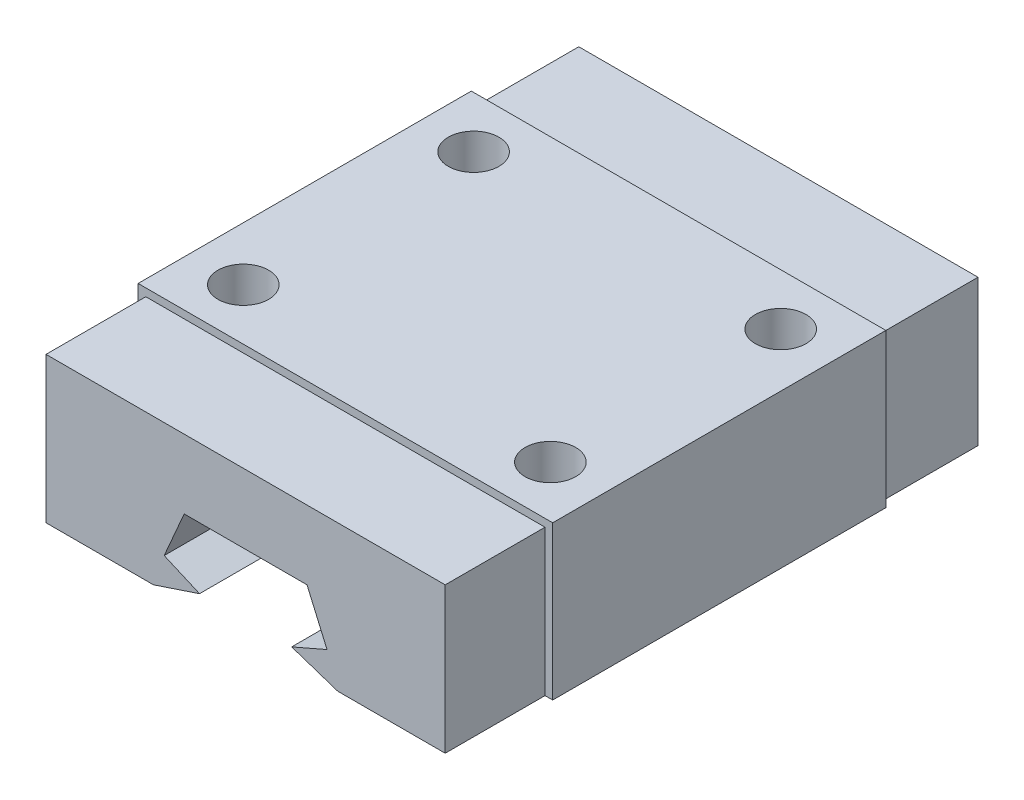
ISO-10303-21;
HEADER;
FILE_DESCRIPTION(('STEP AP214'),'2;1');
FILE_NAME('part.step','',(''),(''),'','','');
FILE_SCHEMA(('AUTOMOTIVE_DESIGN { 1 0 10303 214 1 1 1 1 }'));
ENDSEC;
DATA;
#1=APPLICATION_CONTEXT('core data for automotive mechanical design processes');
#2=APPLICATION_PROTOCOL_DEFINITION('international standard','automotive_design',2000,#1);
#3=PRODUCT_CONTEXT('',#1,'mechanical');
#4=PRODUCT('Part','Part','',(#3));
#5=PRODUCT_RELATED_PRODUCT_CATEGORY('part','',(#4));
#6=PRODUCT_DEFINITION_FORMATION('','',#4);
#7=PRODUCT_DEFINITION_CONTEXT('part definition',#1,'design');
#8=PRODUCT_DEFINITION('design','',#6,#7);
#9=PRODUCT_DEFINITION_SHAPE('','',#8);
#10=(LENGTH_UNIT() NAMED_UNIT(*) SI_UNIT(.MILLI.,.METRE.));
#11=(NAMED_UNIT(*) PLANE_ANGLE_UNIT() SI_UNIT($,.RADIAN.));
#12=(NAMED_UNIT(*) SI_UNIT($,.STERADIAN.) SOLID_ANGLE_UNIT());
#13=UNCERTAINTY_MEASURE_WITH_UNIT(LENGTH_MEASURE(1.E-05),#10,'distance_accuracy_value','');
#14=(GEOMETRIC_REPRESENTATION_CONTEXT(3) GLOBAL_UNCERTAINTY_ASSIGNED_CONTEXT((#13)) GLOBAL_UNIT_ASSIGNED_CONTEXT((#10,
#11,#12)) REPRESENTATION_CONTEXT('',''));
#15=CARTESIAN_POINT('',(0.,0.,0.));
#16=DIRECTION('',(0.,0.,1.));
#17=DIRECTION('',(1.,0.,0.));
#18=AXIS2_PLACEMENT_3D('',#15,#16,#17);
#19=CARTESIAN_POINT('',(0.,-5.,0.));
#20=DIRECTION('',(0.,-1.,0.));
#21=DIRECTION('',(0.,0.,-1.));
#22=AXIS2_PLACEMENT_3D('',#19,#20,#21);
#23=PLANE('',#22);
#24=CARTESIAN_POINT('',(-10.,-5.00000000000001,7.5));
#25=DIRECTION('',(0.,1.,0.));
#26=DIRECTION('',(0.,0.,1.));
#27=AXIS2_PLACEMENT_3D('',#24,#25,#26);
#28=CIRCLE('',#27,1.64999999999998);
#29=CARTESIAN_POINT('',(-10.,-5.00000000000001,9.14999999999998));
#30=VERTEX_POINT('',#29);
#31=EDGE_CURVE('E426',#30,#30,#28,.T.);
#32=ORIENTED_EDGE('',*,*,#31,.T.);
#33=EDGE_LOOP('',(#32));
#34=FACE_BOUND('',#33,.T.);
#35=CARTESIAN_POINT('',(-10.,-5.00000000000001,-7.5));
#36=DIRECTION('',(0.,1.,0.));
#37=DIRECTION('',(0.,0.,1.));
#38=AXIS2_PLACEMENT_3D('',#35,#36,#37);
#39=CIRCLE('',#38,1.64999999999998);
#40=CARTESIAN_POINT('',(-10.,-5.00000000000001,-5.85000000000002));
#41=VERTEX_POINT('',#40);
#42=EDGE_CURVE('E418',#41,#41,#39,.T.);
#43=ORIENTED_EDGE('',*,*,#42,.T.);
#44=EDGE_LOOP('',(#43));
#45=FACE_BOUND('',#44,.T.);
#46=DIRECTION('',(0.,0.,1.));
#47=VECTOR('',#46,1.);
#48=CARTESIAN_POINT('',(-6.,-5.,-17.35));
#49=LINE('',#48,#47);
#50=CARTESIAN_POINT('',(-6.,-5.,-17.35));
#51=VERTEX_POINT('',#50);
#52=CARTESIAN_POINT('',(-6.,-5.,17.35));
#53=VERTEX_POINT('',#52);
#54=EDGE_CURVE('E298',#51,#53,#49,.T.);
#55=ORIENTED_EDGE('',*,*,#54,.T.);
#56=DIRECTION('',(1.,0.,0.));
#57=VECTOR('',#56,1.);
#58=CARTESIAN_POINT('',(13.,-5.,17.35));
#59=LINE('',#58,#57);
#60=CARTESIAN_POINT('',(-13.,-5.,17.35));
#61=VERTEX_POINT('',#60);
#62=EDGE_CURVE('E207',#61,#53,#59,.T.);
#63=ORIENTED_EDGE('',*,*,#62,.F.);
#64=DIRECTION('',(0.,0.,-1.));
#65=VECTOR('',#64,1.);
#66=CARTESIAN_POINT('',(-13.,-5.,17.35));
#67=LINE('',#66,#65);
#68=CARTESIAN_POINT('',(-13.,-5.,10.85));
#69=VERTEX_POINT('',#68);
#70=EDGE_CURVE('E217',#61,#69,#67,.T.);
#71=ORIENTED_EDGE('',*,*,#70,.T.);
#72=DIRECTION('',(-1.,0.,0.));
#73=VECTOR('',#72,1.);
#74=CARTESIAN_POINT('',(13.5,-5.,10.85));
#75=LINE('',#74,#73);
#76=CARTESIAN_POINT('',(-13.5,-5.,10.85));
#77=VERTEX_POINT('',#76);
#78=EDGE_CURVE('E251',#69,#77,#75,.T.);
#79=ORIENTED_EDGE('',*,*,#78,.T.);
#80=DIRECTION('',(0.,0.,-1.));
#81=VECTOR('',#80,1.);
#82=CARTESIAN_POINT('',(-13.5,-5.,10.85));
#83=LINE('',#82,#81);
#84=CARTESIAN_POINT('',(-13.5,-5.,-10.85));
#85=VERTEX_POINT('',#84);
#86=EDGE_CURVE('E179',#77,#85,#83,.T.);
#87=ORIENTED_EDGE('',*,*,#86,.T.);
#88=DIRECTION('',(1.,0.,0.));
#89=VECTOR('',#88,1.);
#90=CARTESIAN_POINT('',(-13.5,-5.,-10.85));
#91=LINE('',#90,#89);
#92=CARTESIAN_POINT('',(-13.,-5.,-10.85));
#93=VERTEX_POINT('',#92);
#94=EDGE_CURVE('E178',#85,#93,#91,.T.);
#95=ORIENTED_EDGE('',*,*,#94,.T.);
#96=DIRECTION('',(0.,0.,1.));
#97=VECTOR('',#96,1.);
#98=CARTESIAN_POINT('',(-13.,-5.,-17.35));
#99=LINE('',#98,#97);
#100=CARTESIAN_POINT('',(-13.,-5.,-17.35));
#101=VERTEX_POINT('',#100);
#102=EDGE_CURVE('E197',#101,#93,#99,.T.);
#103=ORIENTED_EDGE('',*,*,#102,.F.);
#104=DIRECTION('',(-1.,0.,0.));
#105=VECTOR('',#104,1.);
#106=CARTESIAN_POINT('',(-13.,-5.,-17.35));
#107=LINE('',#106,#105);
#108=EDGE_CURVE('E293',#51,#101,#107,.T.);
#109=ORIENTED_EDGE('',*,*,#108,.F.);
#110=EDGE_LOOP('',(#55,#63,#71,#79,#87,#95,#103,#109));
#111=FACE_BOUND('',#110,.T.);
#112=ADVANCED_FACE('F38',(#34,#45,#111),#23,.T.);
#113=CARTESIAN_POINT('',(13.5,5.,-10.85));
#114=DIRECTION('',(1.,0.,0.));
#115=DIRECTION('',(0.,0.,-1.));
#116=AXIS2_PLACEMENT_3D('',#113,#114,#115);
#117=PLANE('',#116);
#118=DIRECTION('',(0.,0.,1.));
#119=VECTOR('',#118,1.);
#120=CARTESIAN_POINT('',(13.5,-5.,-10.85));
#121=LINE('',#120,#119);
#122=CARTESIAN_POINT('',(13.5,-5.,-10.85));
#123=VERTEX_POINT('',#122);
#124=CARTESIAN_POINT('',(13.5,-5.,10.85));
#125=VERTEX_POINT('',#124);
#126=EDGE_CURVE('E237',#123,#125,#121,.T.);
#127=ORIENTED_EDGE('',*,*,#126,.F.);
#128=DIRECTION('',(0.,-1.,0.));
#129=VECTOR('',#128,1.);
#130=CARTESIAN_POINT('',(13.5,5.,-10.85));
#131=LINE('',#130,#129);
#132=CARTESIAN_POINT('',(13.5,5.,-10.85));
#133=VERTEX_POINT('',#132);
#134=EDGE_CURVE('E11',#133,#123,#131,.T.);
#135=ORIENTED_EDGE('',*,*,#134,.F.);
#136=DIRECTION('',(0.,0.,1.));
#137=VECTOR('',#136,1.);
#138=CARTESIAN_POINT('',(13.5,5.,-10.85));
#139=LINE('',#138,#137);
#140=CARTESIAN_POINT('',(13.5,5.,10.85));
#141=VERTEX_POINT('',#140);
#142=EDGE_CURVE('E238',#133,#141,#139,.T.);
#143=ORIENTED_EDGE('',*,*,#142,.T.);
#144=DIRECTION('',(0.,-1.,0.));
#145=VECTOR('',#144,1.);
#146=CARTESIAN_POINT('',(13.5,5.,10.85));
#147=LINE('',#146,#145);
#148=EDGE_CURVE('E249',#141,#125,#147,.T.);
#149=ORIENTED_EDGE('',*,*,#148,.T.);
#150=EDGE_LOOP('',(#127,#135,#143,#149));
#151=FACE_BOUND('',#150,.T.);
#152=ADVANCED_FACE('F382',(#151),#117,.T.);
#153=CARTESIAN_POINT('',(-13.5,5.,-10.85));
#154=DIRECTION('',(0.,0.,-1.));
#155=DIRECTION('',(-1.,0.,0.));
#156=AXIS2_PLACEMENT_3D('',#153,#154,#155);
#157=PLANE('',#156);
#158=DIRECTION('',(0.,1.,0.));
#159=VECTOR('',#158,1.);
#160=CARTESIAN_POINT('',(-13.,4.5,-10.85));
#161=LINE('',#160,#159);
#162=CARTESIAN_POINT('',(-13.,4.5,-10.85));
#163=VERTEX_POINT('',#162);
#164=EDGE_CURVE('E295',#93,#163,#161,.T.);
#165=ORIENTED_EDGE('',*,*,#164,.F.);
#166=ORIENTED_EDGE('',*,*,#94,.F.);
#167=DIRECTION('',(0.,-1.,0.));
#168=VECTOR('',#167,1.);
#169=CARTESIAN_POINT('',(-13.5,5.,-10.85));
#170=LINE('',#169,#168);
#171=CARTESIAN_POINT('',(-13.5,5.,-10.85));
#172=VERTEX_POINT('',#171);
#173=EDGE_CURVE('E48',#172,#85,#170,.T.);
#174=ORIENTED_EDGE('',*,*,#173,.F.);
#175=DIRECTION('',(1.,0.,0.));
#176=VECTOR('',#175,1.);
#177=CARTESIAN_POINT('',(-13.5,5.,-10.85));
#178=LINE('',#177,#176);
#179=EDGE_CURVE('E247',#172,#133,#178,.T.);
#180=ORIENTED_EDGE('',*,*,#179,.T.);
#181=ORIENTED_EDGE('',*,*,#134,.T.);
#182=CARTESIAN_POINT('',(13.,-5.,-10.85));
#183=VERTEX_POINT('',#182);
#184=EDGE_CURVE('E168',#183,#123,#91,.T.);
#185=ORIENTED_EDGE('',*,*,#184,.F.);
#186=DIRECTION('',(0.,-1.,0.));
#187=VECTOR('',#186,1.);
#188=CARTESIAN_POINT('',(13.,-5.,-10.85));
#189=LINE('',#188,#187);
#190=CARTESIAN_POINT('',(13.,4.5,-10.85));
#191=VERTEX_POINT('',#190);
#192=EDGE_CURVE('E171',#191,#183,#189,.T.);
#193=ORIENTED_EDGE('',*,*,#192,.F.);
#194=DIRECTION('',(1.,0.,0.));
#195=VECTOR('',#194,1.);
#196=CARTESIAN_POINT('',(13.,4.5,-10.85));
#197=LINE('',#196,#195);
#198=EDGE_CURVE('E191',#163,#191,#197,.T.);
#199=ORIENTED_EDGE('',*,*,#198,.F.);
#200=EDGE_LOOP('',(#165,#166,#174,#180,#181,#185,#193,#199));
#201=FACE_BOUND('',#200,.T.);
#202=ADVANCED_FACE('F170',(#201),#157,.T.);
#203=CARTESIAN_POINT('',(-13.5,5.,10.85));
#204=DIRECTION('',(-1.,0.,0.));
#205=DIRECTION('',(0.,0.,1.));
#206=AXIS2_PLACEMENT_3D('',#203,#204,#205);
#207=PLANE('',#206);
#208=ORIENTED_EDGE('',*,*,#86,.F.);
#209=DIRECTION('',(0.,-1.,0.));
#210=VECTOR('',#209,1.);
#211=CARTESIAN_POINT('',(-13.5,5.,10.85));
#212=LINE('',#211,#210);
#213=CARTESIAN_POINT('',(-13.5,5.,10.85));
#214=VERTEX_POINT('',#213);
#215=EDGE_CURVE('E259',#214,#77,#212,.T.);
#216=ORIENTED_EDGE('',*,*,#215,.F.);
#217=DIRECTION('',(0.,0.,-1.));
#218=VECTOR('',#217,1.);
#219=CARTESIAN_POINT('',(-13.5,5.,10.85));
#220=LINE('',#219,#218);
#221=EDGE_CURVE('E244',#214,#172,#220,.T.);
#222=ORIENTED_EDGE('',*,*,#221,.T.);
#223=ORIENTED_EDGE('',*,*,#173,.T.);
#224=EDGE_LOOP('',(#208,#216,#222,#223));
#225=FACE_BOUND('',#224,.T.);
#226=ADVANCED_FACE('F449',(#225),#207,.T.);
#227=CARTESIAN_POINT('',(13.5,5.,10.85));
#228=DIRECTION('',(0.,0.,1.));
#229=DIRECTION('',(1.,0.,0.));
#230=AXIS2_PLACEMENT_3D('',#227,#228,#229);
#231=PLANE('',#230);
#232=DIRECTION('',(0.,-1.,0.));
#233=VECTOR('',#232,1.);
#234=CARTESIAN_POINT('',(-13.,-5.,10.85));
#235=LINE('',#234,#233);
#236=CARTESIAN_POINT('',(-13.,4.5,10.85));
#237=VERTEX_POINT('',#236);
#238=EDGE_CURVE('E223',#237,#69,#235,.T.);
#239=ORIENTED_EDGE('',*,*,#238,.F.);
#240=DIRECTION('',(-1.,0.,0.));
#241=VECTOR('',#240,1.);
#242=CARTESIAN_POINT('',(-13.,4.5,10.85));
#243=LINE('',#242,#241);
#244=CARTESIAN_POINT('',(13.,4.5,10.85));
#245=VERTEX_POINT('',#244);
#246=EDGE_CURVE('E220',#245,#237,#243,.T.);
#247=ORIENTED_EDGE('',*,*,#246,.F.);
#248=DIRECTION('',(0.,1.,0.));
#249=VECTOR('',#248,1.);
#250=CARTESIAN_POINT('',(13.,4.5,10.85));
#251=LINE('',#250,#249);
#252=CARTESIAN_POINT('',(13.,-5.,10.85));
#253=VERTEX_POINT('',#252);
#254=EDGE_CURVE('E206',#253,#245,#251,.T.);
#255=ORIENTED_EDGE('',*,*,#254,.F.);
#256=EDGE_CURVE('E252',#125,#253,#75,.T.);
#257=ORIENTED_EDGE('',*,*,#256,.F.);
#258=ORIENTED_EDGE('',*,*,#148,.F.);
#259=DIRECTION('',(-1.,0.,0.));
#260=VECTOR('',#259,1.);
#261=CARTESIAN_POINT('',(13.5,5.,10.85));
#262=LINE('',#261,#260);
#263=EDGE_CURVE('E241',#141,#214,#262,.T.);
#264=ORIENTED_EDGE('',*,*,#263,.T.);
#265=ORIENTED_EDGE('',*,*,#215,.T.);
#266=ORIENTED_EDGE('',*,*,#78,.F.);
#267=EDGE_LOOP('',(#239,#247,#255,#257,#258,#264,#265,#266));
#268=FACE_BOUND('',#267,.T.);
#269=ADVANCED_FACE('F407',(#268),#231,.T.);
#270=CARTESIAN_POINT('',(0.,5.,0.));
#271=DIRECTION('',(0.,-1.,0.));
#272=DIRECTION('',(0.,0.,-1.));
#273=AXIS2_PLACEMENT_3D('',#270,#271,#272);
#274=PLANE('',#273);
#275=CARTESIAN_POINT('',(10.,5.,7.5));
#276=DIRECTION('',(0.,1.,0.));
#277=DIRECTION('',(0.,0.,1.));
#278=AXIS2_PLACEMENT_3D('',#275,#276,#277);
#279=CIRCLE('',#278,1.64999999999998);
#280=CARTESIAN_POINT('',(10.,5.,9.14999999999998));
#281=VERTEX_POINT('',#280);
#282=EDGE_CURVE('E432',#281,#281,#279,.T.);
#283=ORIENTED_EDGE('',*,*,#282,.F.);
#284=EDGE_LOOP('',(#283));
#285=FACE_BOUND('',#284,.T.);
#286=CARTESIAN_POINT('',(-10.,5.,7.5));
#287=DIRECTION('',(0.,1.,0.));
#288=DIRECTION('',(0.,0.,1.));
#289=AXIS2_PLACEMENT_3D('',#286,#287,#288);
#290=CIRCLE('',#289,1.64999999999998);
#291=CARTESIAN_POINT('',(-10.,5.,9.14999999999998));
#292=VERTEX_POINT('',#291);
#293=EDGE_CURVE('E428',#292,#292,#290,.T.);
#294=ORIENTED_EDGE('',*,*,#293,.F.);
#295=EDGE_LOOP('',(#294));
#296=FACE_BOUND('',#295,.T.);
#297=CARTESIAN_POINT('',(-10.,5.,-7.5));
#298=DIRECTION('',(0.,1.,0.));
#299=DIRECTION('',(0.,0.,1.));
#300=AXIS2_PLACEMENT_3D('',#297,#298,#299);
#301=CIRCLE('',#300,1.64999999999998);
#302=CARTESIAN_POINT('',(-10.,5.,-5.85000000000001));
#303=VERTEX_POINT('',#302);
#304=EDGE_CURVE('E423',#303,#303,#301,.T.);
#305=ORIENTED_EDGE('',*,*,#304,.F.);
#306=EDGE_LOOP('',(#305));
#307=FACE_BOUND('',#306,.T.);
#308=CARTESIAN_POINT('',(10.,5.,-7.5));
#309=DIRECTION('',(0.,1.,0.));
#310=DIRECTION('',(0.,0.,1.));
#311=AXIS2_PLACEMENT_3D('',#308,#309,#310);
#312=CIRCLE('',#311,1.64999999999998);
#313=CARTESIAN_POINT('',(10.,5.,-5.85000000000001));
#314=VERTEX_POINT('',#313);
#315=EDGE_CURVE('E416',#314,#314,#312,.T.);
#316=ORIENTED_EDGE('',*,*,#315,.F.);
#317=EDGE_LOOP('',(#316));
#318=FACE_BOUND('',#317,.T.);
#319=ORIENTED_EDGE('',*,*,#142,.F.);
#320=ORIENTED_EDGE('',*,*,#179,.F.);
#321=ORIENTED_EDGE('',*,*,#221,.F.);
#322=ORIENTED_EDGE('',*,*,#263,.F.);
#323=EDGE_LOOP('',(#319,#320,#321,#322));
#324=FACE_BOUND('',#323,.T.);
#325=ADVANCED_FACE('F398',(#285,#296,#307,#318,#324),#274,.F.);
#326=CARTESIAN_POINT('',(10.,-5.00000000000001,7.5));
#327=DIRECTION('',(0.,1.,0.));
#328=DIRECTION('',(0.,0.,1.));
#329=AXIS2_PLACEMENT_3D('',#326,#327,#328);
#330=CIRCLE('',#329,1.64999999999998);
#331=CARTESIAN_POINT('',(10.,-5.00000000000001,9.14999999999998));
#332=VERTEX_POINT('',#331);
#333=EDGE_CURVE('E412',#332,#332,#330,.T.);
#334=ORIENTED_EDGE('',*,*,#333,.T.);
#335=EDGE_LOOP('',(#334));
#336=FACE_BOUND('',#335,.T.);
#337=CARTESIAN_POINT('',(10.,-5.00000000000001,-7.5));
#338=DIRECTION('',(0.,1.,0.));
#339=DIRECTION('',(0.,0.,1.));
#340=AXIS2_PLACEMENT_3D('',#337,#338,#339);
#341=CIRCLE('',#340,1.64999999999998);
#342=CARTESIAN_POINT('',(10.,-5.00000000000001,-5.85000000000002));
#343=VERTEX_POINT('',#342);
#344=EDGE_CURVE('E347',#343,#343,#341,.T.);
#345=ORIENTED_EDGE('',*,*,#344,.T.);
#346=EDGE_LOOP('',(#345));
#347=FACE_BOUND('',#346,.T.);
#348=DIRECTION('',(0.,0.,1.));
#349=VECTOR('',#348,1.);
#350=CARTESIAN_POINT('',(6.,-5.,-17.35));
#351=LINE('',#350,#349);
#352=CARTESIAN_POINT('',(6.,-5.,-17.35));
#353=VERTEX_POINT('',#352);
#354=CARTESIAN_POINT('',(6.,-5.,17.35));
#355=VERTEX_POINT('',#354);
#356=EDGE_CURVE('E281',#353,#355,#351,.T.);
#357=ORIENTED_EDGE('',*,*,#356,.F.);
#358=CARTESIAN_POINT('',(13.,-5.,-17.35));
#359=VERTEX_POINT('',#358);
#360=EDGE_CURVE('E196',#359,#353,#107,.T.);
#361=ORIENTED_EDGE('',*,*,#360,.F.);
#362=DIRECTION('',(0.,0.,1.));
#363=VECTOR('',#362,1.);
#364=CARTESIAN_POINT('',(13.,-5.,-17.35));
#365=LINE('',#364,#363);
#366=EDGE_CURVE('E186',#359,#183,#365,.T.);
#367=ORIENTED_EDGE('',*,*,#366,.T.);
#368=ORIENTED_EDGE('',*,*,#184,.T.);
#369=ORIENTED_EDGE('',*,*,#126,.T.);
#370=ORIENTED_EDGE('',*,*,#256,.T.);
#371=DIRECTION('',(0.,0.,-1.));
#372=VECTOR('',#371,1.);
#373=CARTESIAN_POINT('',(13.,-5.,17.35));
#374=LINE('',#373,#372);
#375=CARTESIAN_POINT('',(13.,-5.,17.35));
#376=VERTEX_POINT('',#375);
#377=EDGE_CURVE('E234',#376,#253,#374,.T.);
#378=ORIENTED_EDGE('',*,*,#377,.F.);
#379=EDGE_CURVE('E211',#355,#376,#59,.T.);
#380=ORIENTED_EDGE('',*,*,#379,.F.);
#381=EDGE_LOOP('',(#357,#361,#367,#368,#369,#370,#378,#380));
#382=FACE_BOUND('',#381,.T.);
#383=ADVANCED_FACE('F194',(#336,#347,#382),#23,.T.);
#384=CARTESIAN_POINT('',(13.,4.5,17.35));
#385=DIRECTION('',(-1.,0.,0.));
#386=DIRECTION('',(0.,0.,1.));
#387=AXIS2_PLACEMENT_3D('',#384,#385,#386);
#388=PLANE('',#387);
#389=ORIENTED_EDGE('',*,*,#254,.T.);
#390=DIRECTION('',(0.,0.,-1.));
#391=VECTOR('',#390,1.);
#392=CARTESIAN_POINT('',(13.,4.5,17.35));
#393=LINE('',#392,#391);
#394=CARTESIAN_POINT('',(13.,4.5,17.35));
#395=VERTEX_POINT('',#394);
#396=EDGE_CURVE('E231',#395,#245,#393,.T.);
#397=ORIENTED_EDGE('',*,*,#396,.F.);
#398=DIRECTION('',(0.,1.,0.));
#399=VECTOR('',#398,1.);
#400=CARTESIAN_POINT('',(13.,4.5,17.35));
#401=LINE('',#400,#399);
#402=EDGE_CURVE('E210',#376,#395,#401,.T.);
#403=ORIENTED_EDGE('',*,*,#402,.F.);
#404=ORIENTED_EDGE('',*,*,#377,.T.);
#405=EDGE_LOOP('',(#389,#397,#403,#404));
#406=FACE_BOUND('',#405,.T.);
#407=ADVANCED_FACE('F397',(#406),#388,.F.);
#408=CARTESIAN_POINT('',(-13.,4.5,17.35));
#409=DIRECTION('',(0.,-1.,0.));
#410=DIRECTION('',(0.,0.,-1.));
#411=AXIS2_PLACEMENT_3D('',#408,#409,#410);
#412=PLANE('',#411);
#413=ORIENTED_EDGE('',*,*,#246,.T.);
#414=DIRECTION('',(0.,0.,-1.));
#415=VECTOR('',#414,1.);
#416=CARTESIAN_POINT('',(-13.,4.5,17.35));
#417=LINE('',#416,#415);
#418=CARTESIAN_POINT('',(-13.,4.5,17.35));
#419=VERTEX_POINT('',#418);
#420=EDGE_CURVE('E228',#419,#237,#417,.T.);
#421=ORIENTED_EDGE('',*,*,#420,.F.);
#422=DIRECTION('',(-1.,0.,0.));
#423=VECTOR('',#422,1.);
#424=CARTESIAN_POINT('',(-13.,4.5,17.35));
#425=LINE('',#424,#423);
#426=EDGE_CURVE('E213',#395,#419,#425,.T.);
#427=ORIENTED_EDGE('',*,*,#426,.F.);
#428=ORIENTED_EDGE('',*,*,#396,.T.);
#429=EDGE_LOOP('',(#413,#421,#427,#428));
#430=FACE_BOUND('',#429,.T.);
#431=ADVANCED_FACE('F404',(#430),#412,.F.);
#432=CARTESIAN_POINT('',(-13.,-5.,17.35));
#433=DIRECTION('',(1.,0.,0.));
#434=DIRECTION('',(0.,0.,-1.));
#435=AXIS2_PLACEMENT_3D('',#432,#433,#434);
#436=PLANE('',#435);
#437=ORIENTED_EDGE('',*,*,#238,.T.);
#438=ORIENTED_EDGE('',*,*,#70,.F.);
#439=DIRECTION('',(0.,-1.,0.));
#440=VECTOR('',#439,1.);
#441=CARTESIAN_POINT('',(-13.,-5.,17.35));
#442=LINE('',#441,#440);
#443=EDGE_CURVE('E215',#419,#61,#442,.T.);
#444=ORIENTED_EDGE('',*,*,#443,.F.);
#445=ORIENTED_EDGE('',*,*,#420,.T.);
#446=EDGE_LOOP('',(#437,#438,#444,#445));
#447=FACE_BOUND('',#446,.T.);
#448=ADVANCED_FACE('F476',(#447),#436,.F.);
#449=CARTESIAN_POINT('',(0.,0.,17.35));
#450=DIRECTION('',(0.,0.,-1.));
#451=DIRECTION('',(-1.,0.,0.));
#452=AXIS2_PLACEMENT_3D('',#449,#450,#451);
#453=PLANE('',#452);
#454=ORIENTED_EDGE('',*,*,#62,.T.);
#455=DIRECTION('',(-0.948683298050514,-0.316227766016837,0.));
#456=VECTOR('',#455,1.);
#457=CARTESIAN_POINT('',(-3.,-4.,17.35));
#458=LINE('',#457,#456);
#459=CARTESIAN_POINT('',(-3.,-4.,17.35));
#460=VERTEX_POINT('',#459);
#461=EDGE_CURVE('E338',#460,#53,#458,.T.);
#462=ORIENTED_EDGE('',*,*,#461,.F.);
#463=DIRECTION('',(0.917245737736622,-0.39832180031226,0.));
#464=VECTOR('',#463,1.);
#465=CARTESIAN_POINT('',(-4.,-3.56574145408934,17.35));
#466=LINE('',#465,#464);
#467=CARTESIAN_POINT('',(-5.302775637732,-3.,17.35));
#468=VERTEX_POINT('',#467);
#469=EDGE_CURVE('E266',#468,#460,#466,.T.);
#470=ORIENTED_EDGE('',*,*,#469,.F.);
#471=DIRECTION('',(0.398321800312263,0.917245737736621,0.));
#472=VECTOR('',#471,1.);
#473=CARTESIAN_POINT('',(-4.,0.,17.35));
#474=LINE('',#473,#472);
#475=CARTESIAN_POINT('',(-4.,0.,17.35));
#476=VERTEX_POINT('',#475);
#477=EDGE_CURVE('E263',#476,#468,#474,.F.);
#478=ORIENTED_EDGE('',*,*,#477,.F.);
#479=DIRECTION('',(-1.,0.,0.));
#480=VECTOR('',#479,1.);
#481=CARTESIAN_POINT('',(4.,0.,17.35));
#482=LINE('',#481,#480);
#483=CARTESIAN_POINT('',(4.,0.,17.35));
#484=VERTEX_POINT('',#483);
#485=EDGE_CURVE('E267',#484,#476,#482,.T.);
#486=ORIENTED_EDGE('',*,*,#485,.F.);
#487=DIRECTION('',(0.398321800312263,-0.917245737736621,0.));
#488=VECTOR('',#487,1.);
#489=CARTESIAN_POINT('',(4.,0.,17.35));
#490=LINE('',#489,#488);
#491=CARTESIAN_POINT('',(5.302775637732,-3.,17.35));
#492=VERTEX_POINT('',#491);
#493=EDGE_CURVE('E277',#492,#484,#490,.F.);
#494=ORIENTED_EDGE('',*,*,#493,.F.);
#495=DIRECTION('',(0.917245737736622,0.398321800312261,0.));
#496=VECTOR('',#495,1.);
#497=CARTESIAN_POINT('',(3.,-4.,17.35));
#498=LINE('',#497,#496);
#499=CARTESIAN_POINT('',(3.,-4.,17.35));
#500=VERTEX_POINT('',#499);
#501=EDGE_CURVE('E278',#500,#492,#498,.T.);
#502=ORIENTED_EDGE('',*,*,#501,.F.);
#503=DIRECTION('',(-0.948683298050514,0.316227766016838,0.));
#504=VECTOR('',#503,1.);
#505=CARTESIAN_POINT('',(6.,-5.,17.35));
#506=LINE('',#505,#504);
#507=EDGE_CURVE('E345',#355,#500,#506,.T.);
#508=ORIENTED_EDGE('',*,*,#507,.F.);
#509=ORIENTED_EDGE('',*,*,#379,.T.);
#510=ORIENTED_EDGE('',*,*,#402,.T.);
#511=ORIENTED_EDGE('',*,*,#426,.T.);
#512=ORIENTED_EDGE('',*,*,#443,.T.);
#513=EDGE_LOOP('',(#454,#462,#470,#478,#486,#494,#502,#508,#509,#510,#511,#512));
#514=FACE_BOUND('',#513,.T.);
#515=ADVANCED_FACE('F364',(#514),#453,.F.);
#516=CARTESIAN_POINT('',(-13.,4.5,-17.35));
#517=DIRECTION('',(1.,0.,0.));
#518=DIRECTION('',(0.,0.,-1.));
#519=AXIS2_PLACEMENT_3D('',#516,#517,#518);
#520=PLANE('',#519);
#521=ORIENTED_EDGE('',*,*,#164,.T.);
#522=DIRECTION('',(0.,0.,1.));
#523=VECTOR('',#522,1.);
#524=CARTESIAN_POINT('',(-13.,4.5,-17.35));
#525=LINE('',#524,#523);
#526=CARTESIAN_POINT('',(-13.,4.5,-17.35));
#527=VERTEX_POINT('',#526);
#528=EDGE_CURVE('E199',#527,#163,#525,.T.);
#529=ORIENTED_EDGE('',*,*,#528,.F.);
#530=DIRECTION('',(0.,1.,0.));
#531=VECTOR('',#530,1.);
#532=CARTESIAN_POINT('',(-13.,4.5,-17.35));
#533=LINE('',#532,#531);
#534=EDGE_CURVE('E190',#101,#527,#533,.T.);
#535=ORIENTED_EDGE('',*,*,#534,.F.);
#536=ORIENTED_EDGE('',*,*,#102,.T.);
#537=EDGE_LOOP('',(#521,#529,#535,#536));
#538=FACE_BOUND('',#537,.T.);
#539=ADVANCED_FACE('F310',(#538),#520,.F.);
#540=CARTESIAN_POINT('',(13.,4.5,-17.35));
#541=DIRECTION('',(0.,-1.,0.));
#542=DIRECTION('',(0.,0.,-1.));
#543=AXIS2_PLACEMENT_3D('',#540,#541,#542);
#544=PLANE('',#543);
#545=ORIENTED_EDGE('',*,*,#198,.T.);
#546=DIRECTION('',(0.,0.,1.));
#547=VECTOR('',#546,1.);
#548=CARTESIAN_POINT('',(13.,4.5,-17.35));
#549=LINE('',#548,#547);
#550=CARTESIAN_POINT('',(13.,4.5,-17.35));
#551=VERTEX_POINT('',#550);
#552=EDGE_CURVE('E189',#551,#191,#549,.T.);
#553=ORIENTED_EDGE('',*,*,#552,.F.);
#554=DIRECTION('',(1.,0.,0.));
#555=VECTOR('',#554,1.);
#556=CARTESIAN_POINT('',(13.,4.5,-17.35));
#557=LINE('',#556,#555);
#558=EDGE_CURVE('E289',#527,#551,#557,.T.);
#559=ORIENTED_EDGE('',*,*,#558,.F.);
#560=ORIENTED_EDGE('',*,*,#528,.T.);
#561=EDGE_LOOP('',(#545,#553,#559,#560));
#562=FACE_BOUND('',#561,.T.);
#563=ADVANCED_FACE('F300',(#562),#544,.F.);
#564=CARTESIAN_POINT('',(13.,-5.,-17.35));
#565=DIRECTION('',(-1.,0.,0.));
#566=DIRECTION('',(0.,0.,1.));
#567=AXIS2_PLACEMENT_3D('',#564,#565,#566);
#568=PLANE('',#567);
#569=ORIENTED_EDGE('',*,*,#192,.T.);
#570=ORIENTED_EDGE('',*,*,#366,.F.);
#571=DIRECTION('',(0.,-1.,0.));
#572=VECTOR('',#571,1.);
#573=CARTESIAN_POINT('',(13.,-5.,-17.35));
#574=LINE('',#573,#572);
#575=EDGE_CURVE('E291',#551,#359,#574,.T.);
#576=ORIENTED_EDGE('',*,*,#575,.F.);
#577=ORIENTED_EDGE('',*,*,#552,.T.);
#578=EDGE_LOOP('',(#569,#570,#576,#577));
#579=FACE_BOUND('',#578,.T.);
#580=ADVANCED_FACE('F184',(#579),#568,.F.);
#581=CARTESIAN_POINT('',(0.,0.,-17.35));
#582=DIRECTION('',(0.,0.,1.));
#583=DIRECTION('',(1.,0.,0.));
#584=AXIS2_PLACEMENT_3D('',#581,#582,#583);
#585=PLANE('',#584);
#586=DIRECTION('',(0.917245737736622,-0.39832180031226,0.));
#587=VECTOR('',#586,1.);
#588=CARTESIAN_POINT('',(-4.,-3.56574145408934,-17.35));
#589=LINE('',#588,#587);
#590=CARTESIAN_POINT('',(-5.302775637732,-3.,-17.35));
#591=VERTEX_POINT('',#590);
#592=CARTESIAN_POINT('',(-3.,-4.,-17.35));
#593=VERTEX_POINT('',#592);
#594=EDGE_CURVE('E271',#591,#593,#589,.T.);
#595=ORIENTED_EDGE('',*,*,#594,.T.);
#596=DIRECTION('',(-0.948683298050514,-0.316227766016837,0.));
#597=VECTOR('',#596,1.);
#598=CARTESIAN_POINT('',(-3.,-4.,-17.35));
#599=LINE('',#598,#597);
#600=EDGE_CURVE('E283',#593,#51,#599,.T.);
#601=ORIENTED_EDGE('',*,*,#600,.T.);
#602=ORIENTED_EDGE('',*,*,#108,.T.);
#603=ORIENTED_EDGE('',*,*,#534,.T.);
#604=ORIENTED_EDGE('',*,*,#558,.T.);
#605=ORIENTED_EDGE('',*,*,#575,.T.);
#606=ORIENTED_EDGE('',*,*,#360,.T.);
#607=DIRECTION('',(-0.948683298050514,0.316227766016838,0.));
#608=VECTOR('',#607,1.);
#609=CARTESIAN_POINT('',(6.,-5.,-17.35));
#610=LINE('',#609,#608);
#611=CARTESIAN_POINT('',(3.,-4.,-17.35));
#612=VERTEX_POINT('',#611);
#613=EDGE_CURVE('E330',#353,#612,#610,.T.);
#614=ORIENTED_EDGE('',*,*,#613,.T.);
#615=DIRECTION('',(0.917245737736622,0.398321800312261,0.));
#616=VECTOR('',#615,1.);
#617=CARTESIAN_POINT('',(3.,-4.,-17.35));
#618=LINE('',#617,#616);
#619=CARTESIAN_POINT('',(5.302775637732,-3.,-17.35));
#620=VERTEX_POINT('',#619);
#621=EDGE_CURVE('E57',#612,#620,#618,.T.);
#622=ORIENTED_EDGE('',*,*,#621,.T.);
#623=DIRECTION('',(0.398321800312263,-0.917245737736621,0.));
#624=VECTOR('',#623,1.);
#625=CARTESIAN_POINT('',(3.36535897358399,1.461435894336,-17.35));
#626=LINE('',#625,#624);
#627=CARTESIAN_POINT('',(4.,0.,-17.35));
#628=VERTEX_POINT('',#627);
#629=EDGE_CURVE('E42',#620,#628,#626,.F.);
#630=ORIENTED_EDGE('',*,*,#629,.T.);
#631=DIRECTION('',(-1.,0.,0.));
#632=VECTOR('',#631,1.);
#633=CARTESIAN_POINT('',(4.,0.,-17.35));
#634=LINE('',#633,#632);
#635=CARTESIAN_POINT('',(-4.,0.,-17.35));
#636=VERTEX_POINT('',#635);
#637=EDGE_CURVE('E272',#628,#636,#634,.T.);
#638=ORIENTED_EDGE('',*,*,#637,.T.);
#639=DIRECTION('',(0.398321800312263,0.917245737736621,0.));
#640=VECTOR('',#639,1.);
#641=CARTESIAN_POINT('',(-3.36535897358399,1.461435894336,-17.35));
#642=LINE('',#641,#640);
#643=EDGE_CURVE('E268',#636,#591,#642,.F.);
#644=ORIENTED_EDGE('',*,*,#643,.T.);
#645=EDGE_LOOP('',(#595,#601,#602,#603,#604,#605,#606,#614,#622,#630,#638,#644));
#646=FACE_BOUND('',#645,.T.);
#647=ADVANCED_FACE('F313',(#646),#585,.F.);
#648=CARTESIAN_POINT('',(-3.,-4.,-17.35));
#649=DIRECTION('',(-0.316227766016837,0.948683298050514,0.));
#650=DIRECTION('',(-0.948683298050514,-0.316227766016837,0.));
#651=AXIS2_PLACEMENT_3D('',#648,#649,#650);
#652=PLANE('',#651);
#653=ORIENTED_EDGE('',*,*,#461,.T.);
#654=ORIENTED_EDGE('',*,*,#54,.F.);
#655=ORIENTED_EDGE('',*,*,#600,.F.);
#656=DIRECTION('',(0.,0.,1.));
#657=VECTOR('',#656,1.);
#658=CARTESIAN_POINT('',(-3.,-4.,-17.35));
#659=LINE('',#658,#657);
#660=EDGE_CURVE('E275',#593,#460,#659,.T.);
#661=ORIENTED_EDGE('',*,*,#660,.T.);
#662=EDGE_LOOP('',(#653,#654,#655,#661));
#663=FACE_BOUND('',#662,.T.);
#664=ADVANCED_FACE('F369',(#663),#652,.F.);
#665=CARTESIAN_POINT('',(-4.,-3.56574145408934,-17.35));
#666=DIRECTION('',(-0.39832180031226,-0.917245737736622,0.));
#667=DIRECTION('',(0.917245737736622,-0.39832180031226,0.));
#668=AXIS2_PLACEMENT_3D('',#665,#666,#667);
#669=PLANE('',#668);
#670=ORIENTED_EDGE('',*,*,#469,.T.);
#671=ORIENTED_EDGE('',*,*,#660,.F.);
#672=ORIENTED_EDGE('',*,*,#594,.F.);
#673=DIRECTION('',(0.,0.,-1.));
#674=VECTOR('',#673,1.);
#675=CARTESIAN_POINT('',(-5.302775637732,-3.,-17.35));
#676=LINE('',#675,#674);
#677=EDGE_CURVE('E273',#591,#468,#676,.F.);
#678=ORIENTED_EDGE('',*,*,#677,.T.);
#679=EDGE_LOOP('',(#670,#671,#672,#678));
#680=FACE_BOUND('',#679,.T.);
#681=ADVANCED_FACE('F367',(#680),#669,.F.);
#682=CARTESIAN_POINT('',(-4.,0.,-17.35));
#683=DIRECTION('',(0.917245737736621,-0.398321800312263,0.));
#684=DIRECTION('',(0.398321800312263,0.917245737736621,0.));
#685=AXIS2_PLACEMENT_3D('',#682,#683,#684);
#686=PLANE('',#685);
#687=ORIENTED_EDGE('',*,*,#477,.T.);
#688=ORIENTED_EDGE('',*,*,#677,.F.);
#689=ORIENTED_EDGE('',*,*,#643,.F.);
#690=DIRECTION('',(0.,0.,1.));
#691=VECTOR('',#690,1.);
#692=CARTESIAN_POINT('',(-4.,0.,-17.35));
#693=LINE('',#692,#691);
#694=EDGE_CURVE('E276',#636,#476,#693,.T.);
#695=ORIENTED_EDGE('',*,*,#694,.T.);
#696=EDGE_LOOP('',(#687,#688,#689,#695));
#697=FACE_BOUND('',#696,.T.);
#698=ADVANCED_FACE('F357',(#697),#686,.T.);
#699=CARTESIAN_POINT('',(4.,0.,-17.35));
#700=DIRECTION('',(0.,1.,0.));
#701=DIRECTION('',(-1.,0.,0.));
#702=AXIS2_PLACEMENT_3D('',#699,#700,#701);
#703=PLANE('',#702);
#704=ORIENTED_EDGE('',*,*,#485,.T.);
#705=ORIENTED_EDGE('',*,*,#694,.F.);
#706=ORIENTED_EDGE('',*,*,#637,.F.);
#707=DIRECTION('',(0.,0.,1.));
#708=VECTOR('',#707,1.);
#709=CARTESIAN_POINT('',(4.,0.,-17.35));
#710=LINE('',#709,#708);
#711=EDGE_CURVE('E279',#628,#484,#710,.T.);
#712=ORIENTED_EDGE('',*,*,#711,.T.);
#713=EDGE_LOOP('',(#704,#705,#706,#712));
#714=FACE_BOUND('',#713,.T.);
#715=ADVANCED_FACE('F362',(#714),#703,.F.);
#716=CARTESIAN_POINT('',(4.,0.,-17.35));
#717=DIRECTION('',(-0.917245737736621,-0.398321800312263,0.));
#718=DIRECTION('',(0.398321800312263,-0.917245737736621,0.));
#719=AXIS2_PLACEMENT_3D('',#716,#717,#718);
#720=PLANE('',#719);
#721=ORIENTED_EDGE('',*,*,#493,.T.);
#722=ORIENTED_EDGE('',*,*,#711,.F.);
#723=ORIENTED_EDGE('',*,*,#629,.F.);
#724=DIRECTION('',(0.,0.,-1.));
#725=VECTOR('',#724,1.);
#726=CARTESIAN_POINT('',(5.302775637732,-3.,-17.35));
#727=LINE('',#726,#725);
#728=EDGE_CURVE('E80',#620,#492,#727,.F.);
#729=ORIENTED_EDGE('',*,*,#728,.T.);
#730=EDGE_LOOP('',(#721,#722,#723,#729));
#731=FACE_BOUND('',#730,.T.);
#732=ADVANCED_FACE('F40',(#731),#720,.T.);
#733=CARTESIAN_POINT('',(3.,-4.,-17.35));
#734=DIRECTION('',(0.398321800312261,-0.917245737736622,0.));
#735=DIRECTION('',(0.917245737736622,0.398321800312261,0.));
#736=AXIS2_PLACEMENT_3D('',#733,#734,#735);
#737=PLANE('',#736);
#738=ORIENTED_EDGE('',*,*,#501,.T.);
#739=ORIENTED_EDGE('',*,*,#728,.F.);
#740=ORIENTED_EDGE('',*,*,#621,.F.);
#741=DIRECTION('',(0.,0.,1.));
#742=VECTOR('',#741,1.);
#743=CARTESIAN_POINT('',(3.,-4.,-17.35));
#744=LINE('',#743,#742);
#745=EDGE_CURVE('E86',#612,#500,#744,.T.);
#746=ORIENTED_EDGE('',*,*,#745,.T.);
#747=EDGE_LOOP('',(#738,#739,#740,#746));
#748=FACE_BOUND('',#747,.T.);
#749=ADVANCED_FACE('F331',(#748),#737,.F.);
#750=CARTESIAN_POINT('',(6.,-5.,-17.35));
#751=DIRECTION('',(0.316227766016838,0.948683298050514,0.));
#752=DIRECTION('',(-0.948683298050514,0.316227766016838,0.));
#753=AXIS2_PLACEMENT_3D('',#750,#751,#752);
#754=PLANE('',#753);
#755=ORIENTED_EDGE('',*,*,#507,.T.);
#756=ORIENTED_EDGE('',*,*,#745,.F.);
#757=ORIENTED_EDGE('',*,*,#613,.F.);
#758=ORIENTED_EDGE('',*,*,#356,.T.);
#759=EDGE_LOOP('',(#755,#756,#757,#758));
#760=FACE_BOUND('',#759,.T.);
#761=ADVANCED_FACE('F459',(#760),#754,.F.);
#762=CARTESIAN_POINT('',(10.,5.,-7.5));
#763=DIRECTION('',(0.,1.,0.));
#764=DIRECTION('',(0.,0.,1.));
#765=AXIS2_PLACEMENT_3D('',#762,#763,#764);
#766=CYLINDRICAL_SURFACE('',#765,1.64999999999998);
#767=ORIENTED_EDGE('',*,*,#344,.F.);
#768=EDGE_LOOP('',(#767));
#769=FACE_BOUND('',#768,.T.);
#770=ORIENTED_EDGE('',*,*,#315,.T.);
#771=EDGE_LOOP('',(#770));
#772=FACE_BOUND('',#771,.T.);
#773=ADVANCED_FACE('F461',(#769,#772),#766,.F.);
#774=CARTESIAN_POINT('',(-10.,5.,-7.5));
#775=DIRECTION('',(0.,1.,0.));
#776=DIRECTION('',(0.,0.,1.));
#777=AXIS2_PLACEMENT_3D('',#774,#775,#776);
#778=CYLINDRICAL_SURFACE('',#777,1.64999999999998);
#779=ORIENTED_EDGE('',*,*,#42,.F.);
#780=EDGE_LOOP('',(#779));
#781=FACE_BOUND('',#780,.T.);
#782=ORIENTED_EDGE('',*,*,#304,.T.);
#783=EDGE_LOOP('',(#782));
#784=FACE_BOUND('',#783,.T.);
#785=ADVANCED_FACE('F466',(#781,#784),#778,.F.);
#786=CARTESIAN_POINT('',(-10.,5.,7.5));
#787=DIRECTION('',(0.,1.,0.));
#788=DIRECTION('',(0.,0.,1.));
#789=AXIS2_PLACEMENT_3D('',#786,#787,#788);
#790=CYLINDRICAL_SURFACE('',#789,1.64999999999998);
#791=ORIENTED_EDGE('',*,*,#31,.F.);
#792=EDGE_LOOP('',(#791));
#793=FACE_BOUND('',#792,.T.);
#794=ORIENTED_EDGE('',*,*,#293,.T.);
#795=EDGE_LOOP('',(#794));
#796=FACE_BOUND('',#795,.T.);
#797=ADVANCED_FACE('F590',(#793,#796),#790,.F.);
#798=CARTESIAN_POINT('',(10.,5.,7.5));
#799=DIRECTION('',(0.,1.,0.));
#800=DIRECTION('',(0.,0.,1.));
#801=AXIS2_PLACEMENT_3D('',#798,#799,#800);
#802=CYLINDRICAL_SURFACE('',#801,1.64999999999998);
#803=ORIENTED_EDGE('',*,*,#333,.F.);
#804=EDGE_LOOP('',(#803));
#805=FACE_BOUND('',#804,.T.);
#806=ORIENTED_EDGE('',*,*,#282,.T.);
#807=EDGE_LOOP('',(#806));
#808=FACE_BOUND('',#807,.T.);
#809=ADVANCED_FACE('F436',(#805,#808),#802,.F.);
#810=CLOSED_SHELL('',(#112,#152,#202,#226,#269,#325,#383,#407,#431,#448,#515,#539,#563,#580,
#647,#664,#681,#698,#715,#732,#749,#761,#773,#785,#797,#809));
#811=MANIFOLD_SOLID_BREP('B2',#810);
#812=ADVANCED_BREP_SHAPE_REPRESENTATION('',(#18,#811),#14);
#813=SHAPE_DEFINITION_REPRESENTATION(#9,#812);
ENDSEC;
END-ISO-10303-21;
